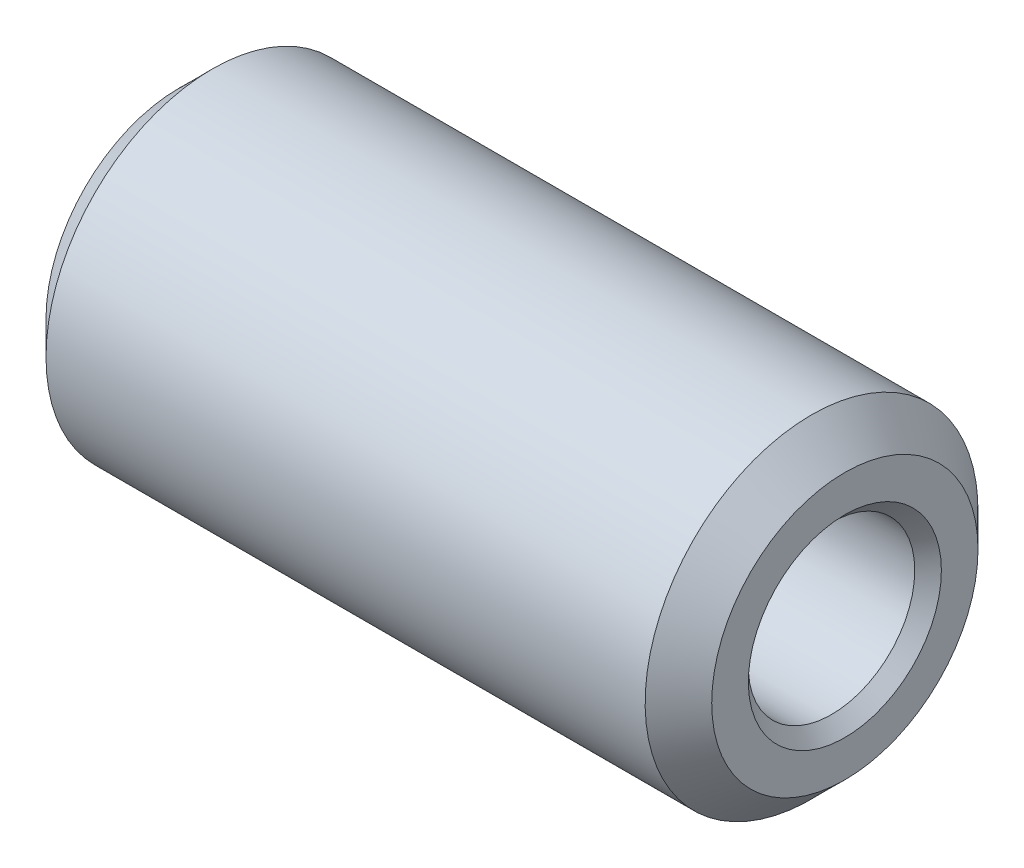
ISO-10303-21;
HEADER;
FILE_DESCRIPTION(('STEP AP214'),'2;1');
FILE_NAME('part.step','',(''),(''),'','','');
FILE_SCHEMA(('AUTOMOTIVE_DESIGN { 1 0 10303 214 1 1 1 1 }'));
ENDSEC;
DATA;
#1=APPLICATION_CONTEXT('core data for automotive mechanical design processes');
#2=APPLICATION_PROTOCOL_DEFINITION('international standard','automotive_design',2000,#1);
#3=PRODUCT_CONTEXT('',#1,'mechanical');
#4=PRODUCT('Part','Part','',(#3));
#5=PRODUCT_RELATED_PRODUCT_CATEGORY('part','',(#4));
#6=PRODUCT_DEFINITION_FORMATION('','',#4);
#7=PRODUCT_DEFINITION_CONTEXT('part definition',#1,'design');
#8=PRODUCT_DEFINITION('design','',#6,#7);
#9=PRODUCT_DEFINITION_SHAPE('','',#8);
#10=(LENGTH_UNIT() NAMED_UNIT(*) SI_UNIT(.MILLI.,.METRE.));
#11=(NAMED_UNIT(*) PLANE_ANGLE_UNIT() SI_UNIT($,.RADIAN.));
#12=(NAMED_UNIT(*) SI_UNIT($,.STERADIAN.) SOLID_ANGLE_UNIT());
#13=UNCERTAINTY_MEASURE_WITH_UNIT(LENGTH_MEASURE(1.E-05),#10,'distance_accuracy_value','');
#14=(GEOMETRIC_REPRESENTATION_CONTEXT(3) GLOBAL_UNCERTAINTY_ASSIGNED_CONTEXT((#13)) GLOBAL_UNIT_ASSIGNED_CONTEXT((#10,
#11,#12)) REPRESENTATION_CONTEXT('',''));
#15=CARTESIAN_POINT('',(0.,0.,0.));
#16=DIRECTION('',(0.,0.,1.));
#17=DIRECTION('',(1.,0.,0.));
#18=AXIS2_PLACEMENT_3D('',#15,#16,#17);
#19=CARTESIAN_POINT('',(0.,0.,0.));
#20=DIRECTION('',(-1.,0.,0.));
#21=DIRECTION('',(0.,-1.,0.));
#22=AXIS2_PLACEMENT_3D('',#19,#20,#21);
#23=PLANE('',#22);
#24=CARTESIAN_POINT('',(0.,0.,0.));
#25=DIRECTION('',(-1.,0.,0.));
#26=DIRECTION('',(0.,-1.,0.));
#27=AXIS2_PLACEMENT_3D('',#24,#25,#26);
#28=CIRCLE('',#27,2.);
#29=CARTESIAN_POINT('',(0.,-2.,0.));
#30=VERTEX_POINT('',#29);
#31=EDGE_CURVE('E42',#30,#30,#28,.T.);
#32=ORIENTED_EDGE('',*,*,#31,.T.);
#33=EDGE_LOOP('',(#32));
#34=FACE_BOUND('',#33,.T.);
#35=CARTESIAN_POINT('',(0.,0.,0.));
#36=DIRECTION('',(-1.,0.,0.));
#37=DIRECTION('',(0.,-1.,0.));
#38=AXIS2_PLACEMENT_3D('',#35,#36,#37);
#39=CIRCLE('',#38,1.45);
#40=CARTESIAN_POINT('',(0.,-1.45,0.));
#41=VERTEX_POINT('',#40);
#42=EDGE_CURVE('E64',#41,#41,#39,.F.);
#43=ORIENTED_EDGE('',*,*,#42,.T.);
#44=EDGE_LOOP('',(#43));
#45=FACE_BOUND('',#44,.T.);
#46=ADVANCED_FACE('F35',(#34,#45),#23,.T.);
#47=CARTESIAN_POINT('',(9.99999999999999,0.,0.));
#48=DIRECTION('',(1.,0.,0.));
#49=DIRECTION('',(0.,1.,0.));
#50=AXIS2_PLACEMENT_3D('',#47,#48,#49);
#51=CYLINDRICAL_SURFACE('',#50,2.5);
#52=CARTESIAN_POINT('',(0.5,0.,0.));
#53=DIRECTION('',(-1.,0.,0.));
#54=DIRECTION('',(0.,-1.,0.));
#55=AXIS2_PLACEMENT_3D('',#52,#53,#54);
#56=CIRCLE('',#55,2.5);
#57=CARTESIAN_POINT('',(0.499999999999999,-2.5,0.));
#58=VERTEX_POINT('',#57);
#59=EDGE_CURVE('E46',#58,#58,#56,.F.);
#60=ORIENTED_EDGE('',*,*,#59,.T.);
#61=EDGE_LOOP('',(#60));
#62=FACE_BOUND('',#61,.T.);
#63=CARTESIAN_POINT('',(9.5,0.,0.));
#64=DIRECTION('',(1.,0.,0.));
#65=DIRECTION('',(0.,1.,0.));
#66=AXIS2_PLACEMENT_3D('',#63,#64,#65);
#67=CIRCLE('',#66,2.5);
#68=CARTESIAN_POINT('',(9.5,2.5,0.));
#69=VERTEX_POINT('',#68);
#70=EDGE_CURVE('E50',#69,#69,#67,.F.);
#71=ORIENTED_EDGE('',*,*,#70,.T.);
#72=EDGE_LOOP('',(#71));
#73=FACE_BOUND('',#72,.T.);
#74=ADVANCED_FACE('F88',(#62,#73),#51,.T.);
#75=CARTESIAN_POINT('',(10.,2.5,0.));
#76=DIRECTION('',(1.,0.,0.));
#77=DIRECTION('',(0.,1.,0.));
#78=AXIS2_PLACEMENT_3D('',#75,#76,#77);
#79=PLANE('',#78);
#80=CARTESIAN_POINT('',(10.,0.,0.));
#81=DIRECTION('',(1.,0.,0.));
#82=DIRECTION('',(0.,1.,0.));
#83=AXIS2_PLACEMENT_3D('',#80,#81,#82);
#84=CIRCLE('',#83,2.00000000000001);
#85=CARTESIAN_POINT('',(10.,2.,0.));
#86=VERTEX_POINT('',#85);
#87=EDGE_CURVE('E10',#86,#86,#84,.T.);
#88=ORIENTED_EDGE('',*,*,#87,.T.);
#89=EDGE_LOOP('',(#88));
#90=FACE_BOUND('',#89,.T.);
#91=CARTESIAN_POINT('',(10.,0.,0.));
#92=DIRECTION('',(1.,0.,0.));
#93=DIRECTION('',(0.,1.,0.));
#94=AXIS2_PLACEMENT_3D('',#91,#92,#93);
#95=CIRCLE('',#94,1.44999999999998);
#96=CARTESIAN_POINT('',(10.,1.44999999999997,0.));
#97=VERTEX_POINT('',#96);
#98=EDGE_CURVE('E55',#97,#97,#95,.F.);
#99=ORIENTED_EDGE('',*,*,#98,.T.);
#100=EDGE_LOOP('',(#99));
#101=FACE_BOUND('',#100,.T.);
#102=ADVANCED_FACE('F82',(#90,#101),#79,.T.);
#103=CARTESIAN_POINT('',(10.,0.,0.));
#104=DIRECTION('',(1.,0.,0.));
#105=DIRECTION('',(0.,0.,-1.));
#106=AXIS2_PLACEMENT_3D('',#103,#104,#105);
#107=CYLINDRICAL_SURFACE('',#106,1.24999999999999);
#108=CARTESIAN_POINT('',(0.200000000000004,0.,0.));
#109=DIRECTION('',(-1.,0.,0.));
#110=DIRECTION('',(0.,0.,1.));
#111=AXIS2_PLACEMENT_3D('',#108,#109,#110);
#112=CIRCLE('',#111,1.24999999999999);
#113=CARTESIAN_POINT('',(0.200000000000004,0.,1.24999999999999));
#114=VERTEX_POINT('',#113);
#115=EDGE_CURVE('E58',#114,#114,#112,.T.);
#116=ORIENTED_EDGE('',*,*,#115,.T.);
#117=EDGE_LOOP('',(#116));
#118=FACE_BOUND('',#117,.T.);
#119=CARTESIAN_POINT('',(9.80000000000001,0.,0.));
#120=DIRECTION('',(1.,0.,0.));
#121=DIRECTION('',(0.,0.,-1.));
#122=AXIS2_PLACEMENT_3D('',#119,#120,#121);
#123=CIRCLE('',#122,1.24999999999999);
#124=CARTESIAN_POINT('',(9.80000000000001,0.,-1.24999999999999));
#125=VERTEX_POINT('',#124);
#126=EDGE_CURVE('E61',#125,#125,#123,.T.);
#127=ORIENTED_EDGE('',*,*,#126,.T.);
#128=EDGE_LOOP('',(#127));
#129=FACE_BOUND('',#128,.T.);
#130=ADVANCED_FACE('F72',(#118,#129),#107,.F.);
#131=CARTESIAN_POINT('',(0.,0.,0.));
#132=DIRECTION('',(-1.,0.,0.));
#133=DIRECTION('',(0.,0.,1.));
#134=AXIS2_PLACEMENT_3D('',#131,#132,#133);
#135=CONICAL_SURFACE('',#134,1.45,0.785398163397446);
#136=ORIENTED_EDGE('',*,*,#115,.F.);
#137=EDGE_LOOP('',(#136));
#138=FACE_BOUND('',#137,.T.);
#139=ORIENTED_EDGE('',*,*,#42,.F.);
#140=EDGE_LOOP('',(#139));
#141=FACE_BOUND('',#140,.T.);
#142=ADVANCED_FACE('F69',(#138,#141),#135,.F.);
#143=CARTESIAN_POINT('',(9.80000000000001,0.,0.));
#144=DIRECTION('',(1.,0.,0.));
#145=DIRECTION('',(0.,0.,-1.));
#146=AXIS2_PLACEMENT_3D('',#143,#144,#145);
#147=CONICAL_SURFACE('',#146,1.24999999999999,0.785398163397448);
#148=ORIENTED_EDGE('',*,*,#98,.F.);
#149=EDGE_LOOP('',(#148));
#150=FACE_BOUND('',#149,.T.);
#151=ORIENTED_EDGE('',*,*,#126,.F.);
#152=EDGE_LOOP('',(#151));
#153=FACE_BOUND('',#152,.T.);
#154=ADVANCED_FACE('F71',(#150,#153),#147,.F.);
#155=CARTESIAN_POINT('',(0.5,0.,0.));
#156=DIRECTION('',(1.,0.,0.));
#157=DIRECTION('',(0.,1.,0.));
#158=AXIS2_PLACEMENT_3D('',#155,#156,#157);
#159=CONICAL_SURFACE('',#158,2.5,0.78539816339745);
#160=ORIENTED_EDGE('',*,*,#31,.F.);
#161=EDGE_LOOP('',(#160));
#162=FACE_BOUND('',#161,.T.);
#163=ORIENTED_EDGE('',*,*,#59,.F.);
#164=EDGE_LOOP('',(#163));
#165=FACE_BOUND('',#164,.T.);
#166=ADVANCED_FACE('F79',(#162,#165),#159,.T.);
#167=CARTESIAN_POINT('',(10.,0.,0.));
#168=DIRECTION('',(-1.,0.,0.));
#169=DIRECTION('',(0.,-1.,0.));
#170=AXIS2_PLACEMENT_3D('',#167,#168,#169);
#171=CONICAL_SURFACE('',#170,2.00000000000001,0.785398163397445);
#172=ORIENTED_EDGE('',*,*,#70,.F.);
#173=EDGE_LOOP('',(#172));
#174=FACE_BOUND('',#173,.T.);
#175=ORIENTED_EDGE('',*,*,#87,.F.);
#176=EDGE_LOOP('',(#175));
#177=FACE_BOUND('',#176,.T.);
#178=ADVANCED_FACE('F37',(#174,#177),#171,.T.);
#179=CLOSED_SHELL('',(#46,#74,#102,#130,#142,#154,#166,#178));
#180=MANIFOLD_SOLID_BREP('B2',#179);
#181=ADVANCED_BREP_SHAPE_REPRESENTATION('',(#18,#180),#14);
#182=SHAPE_DEFINITION_REPRESENTATION(#9,#181);
ENDSEC;
END-ISO-10303-21;
